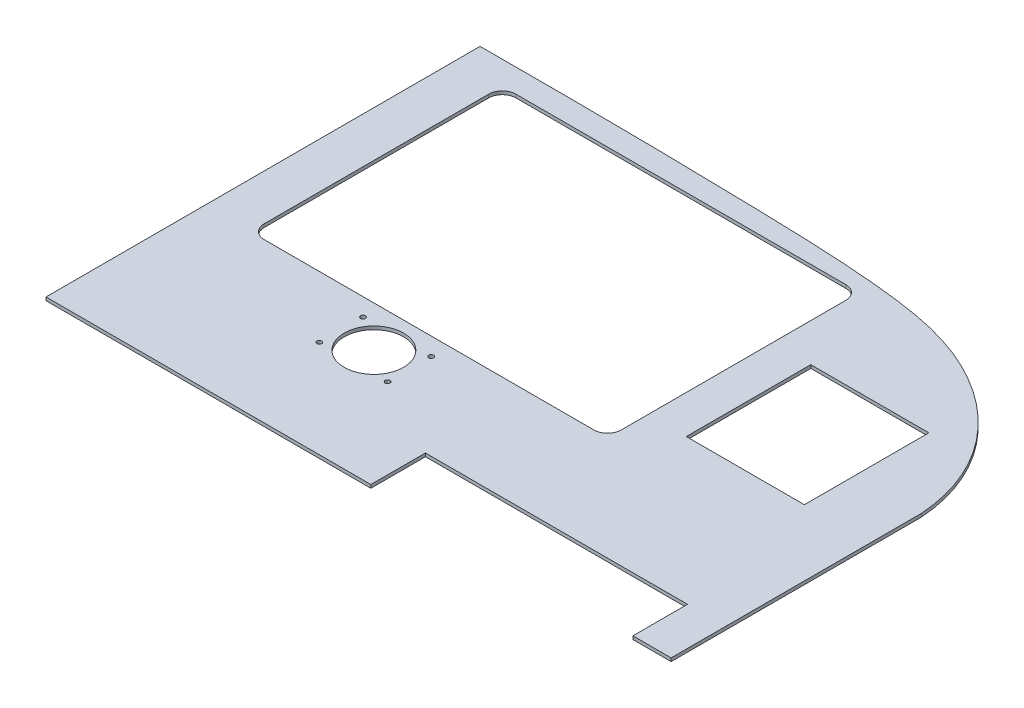
ISO-10303-21;
HEADER;
FILE_DESCRIPTION(('STEP AP214'),'2;1');
FILE_NAME('part.step','',(''),(''),'','','');
FILE_SCHEMA(('AUTOMOTIVE_DESIGN { 1 0 10303 214 1 1 1 1 }'));
ENDSEC;
DATA;
#1=APPLICATION_CONTEXT('core data for automotive mechanical design processes');
#2=APPLICATION_PROTOCOL_DEFINITION('international standard','automotive_design',2000,#1);
#3=PRODUCT_CONTEXT('',#1,'mechanical');
#4=PRODUCT('Part','Part','',(#3));
#5=PRODUCT_RELATED_PRODUCT_CATEGORY('part','',(#4));
#6=PRODUCT_DEFINITION_FORMATION('','',#4);
#7=PRODUCT_DEFINITION_CONTEXT('part definition',#1,'design');
#8=PRODUCT_DEFINITION('design','',#6,#7);
#9=PRODUCT_DEFINITION_SHAPE('','',#8);
#10=(LENGTH_UNIT() NAMED_UNIT(*) SI_UNIT(.MILLI.,.METRE.));
#11=(NAMED_UNIT(*) PLANE_ANGLE_UNIT() SI_UNIT($,.RADIAN.));
#12=(NAMED_UNIT(*) SI_UNIT($,.STERADIAN.) SOLID_ANGLE_UNIT());
#13=UNCERTAINTY_MEASURE_WITH_UNIT(LENGTH_MEASURE(1.E-05),#10,'distance_accuracy_value','');
#14=(GEOMETRIC_REPRESENTATION_CONTEXT(3) GLOBAL_UNCERTAINTY_ASSIGNED_CONTEXT((#13)) GLOBAL_UNIT_ASSIGNED_CONTEXT((#10,
#11,#12)) REPRESENTATION_CONTEXT('',''));
#15=CARTESIAN_POINT('',(0.,0.,0.));
#16=DIRECTION('',(0.,0.,1.));
#17=DIRECTION('',(1.,0.,0.));
#18=AXIS2_PLACEMENT_3D('',#15,#16,#17);
#19=CARTESIAN_POINT('',(291.81867190255,2.4,-147.875787180566));
#20=DIRECTION('',(0.,1.,0.));
#21=DIRECTION('',(0.,0.,1.));
#22=AXIS2_PLACEMENT_3D('',#19,#20,#21);
#23=PLANE('',#22);
#24=CARTESIAN_POINT('',(160.955943970806,2.4,94.9187674166693));
#25=DIRECTION('',(0.,1.,0.));
#26=DIRECTION('',(0.,0.,1.));
#27=AXIS2_PLACEMENT_3D('',#24,#25,#26);
#28=CIRCLE('',#27,1.74999999999998);
#29=CARTESIAN_POINT('',(160.955943970806,2.4,96.6687674166693));
#30=VERTEX_POINT('',#29);
#31=EDGE_CURVE('E237',#30,#30,#28,.T.);
#32=ORIENTED_EDGE('',*,*,#31,.F.);
#33=EDGE_LOOP('',(#32));
#34=FACE_BOUND('',#33,.T.);
#35=CARTESIAN_POINT('',(210.955943970806,2.4,94.9187674166693));
#36=DIRECTION('',(0.,1.,0.));
#37=DIRECTION('',(0.,0.,1.));
#38=AXIS2_PLACEMENT_3D('',#35,#36,#37);
#39=CIRCLE('',#38,1.74999999999998);
#40=CARTESIAN_POINT('',(210.955943970806,2.4,96.6687674166693));
#41=VERTEX_POINT('',#40);
#42=EDGE_CURVE('E336',#41,#41,#39,.T.);
#43=ORIENTED_EDGE('',*,*,#42,.F.);
#44=EDGE_LOOP('',(#43));
#45=FACE_BOUND('',#44,.T.);
#46=DIRECTION('',(0.,0.,-1.));
#47=VECTOR('',#46,1.);
#48=CARTESIAN_POINT('',(270.055943970805,2.4,166.244094236359));
#49=LINE('',#48,#47);
#50=CARTESIAN_POINT('',(270.055943970805,2.4,166.244094236359));
#51=VERTEX_POINT('',#50);
#52=CARTESIAN_POINT('',(270.055943970805,2.4,126.244094236359));
#53=VERTEX_POINT('',#52);
#54=EDGE_CURVE('E352',#51,#53,#49,.T.);
#55=ORIENTED_EDGE('',*,*,#54,.T.);
#56=DIRECTION('',(1.,0.,0.));
#57=VECTOR('',#56,1.);
#58=CARTESIAN_POINT('',(462.055943970805,2.4,126.244094236359));
#59=LINE('',#58,#57);
#60=CARTESIAN_POINT('',(462.055943970805,2.4,126.244094236359));
#61=VERTEX_POINT('',#60);
#62=EDGE_CURVE('E356',#53,#61,#59,.T.);
#63=ORIENTED_EDGE('',*,*,#62,.T.);
#64=DIRECTION('',(0.,0.,1.));
#65=VECTOR('',#64,1.);
#66=CARTESIAN_POINT('',(462.055943970805,2.4,126.244094236359));
#67=LINE('',#66,#65);
#68=CARTESIAN_POINT('',(462.055943970805,2.4,166.244094236359));
#69=VERTEX_POINT('',#68);
#70=EDGE_CURVE('E360',#61,#69,#67,.T.);
#71=ORIENTED_EDGE('',*,*,#70,.T.);
#72=DIRECTION('',(1.,0.,0.));
#73=VECTOR('',#72,1.);
#74=CARTESIAN_POINT('',(462.055943970805,2.4,166.244094236359));
#75=LINE('',#74,#73);
#76=CARTESIAN_POINT('',(490.055943970805,2.4,166.244094236359));
#77=VERTEX_POINT('',#76);
#78=EDGE_CURVE('E363',#69,#77,#75,.T.);
#79=ORIENTED_EDGE('',*,*,#78,.T.);
#80=DIRECTION('',(0.,0.,-1.));
#81=VECTOR('',#80,1.);
#82=CARTESIAN_POINT('',(490.055943970805,2.4,166.244094236359));
#83=LINE('',#82,#81);
#84=CARTESIAN_POINT('',(490.055943970805,2.4,-17.1594549133934));
#85=VERTEX_POINT('',#84);
#86=EDGE_CURVE('E366',#77,#85,#83,.T.);
#87=ORIENTED_EDGE('',*,*,#86,.T.);
#88=CARTESIAN_POINT('',(490.055943970805,2.4,-17.1594549133934));
#89=CARTESIAN_POINT('',(485.960084459969,2.4,-74.2725584664773));
#90=CARTESIAN_POINT('',(425.617825051017,2.4,-131.81341344977));
#91=CARTESIAN_POINT('',(322.889642457425,2.4,-147.223796338718));
#92=CARTESIAN_POINT('',(202.389819544414,2.4,-151.163122700745));
#93=CARTESIAN_POINT('',(102.52055171968,2.4,-152.083892996162));
#94=CARTESIAN_POINT('',(32.0559439708054,2.4,-151.755905763641));
#95=B_SPLINE_CURVE_WITH_KNOTS('',3,(#88,#89,#90,#91,#92,#93,#94),.UNSPECIFIED.,.F.,.F.,(4,1,1,1,
4),(0.,0.30392132411296,0.421595858926992,0.595032022149587,1.),.UNSPECIFIED.);
#96=CARTESIAN_POINT('',(32.0559439708054,2.4,-151.755905763641));
#97=VERTEX_POINT('',#96);
#98=EDGE_CURVE('E369',#85,#97,#95,.T.);
#99=ORIENTED_EDGE('',*,*,#98,.T.);
#100=DIRECTION('',(0.,0.,1.));
#101=VECTOR('',#100,1.);
#102=CARTESIAN_POINT('',(32.0559439708054,2.4,166.244094236359));
#103=LINE('',#102,#101);
#104=CARTESIAN_POINT('',(32.0559439708054,2.4,166.244094236359));
#105=VERTEX_POINT('',#104);
#106=EDGE_CURVE('E375',#97,#105,#103,.T.);
#107=ORIENTED_EDGE('',*,*,#106,.T.);
#108=DIRECTION('',(1.,0.,0.));
#109=VECTOR('',#108,1.);
#110=CARTESIAN_POINT('',(32.0559439708054,2.4,166.244094236359));
#111=LINE('',#110,#109);
#112=EDGE_CURVE('E448',#105,#51,#111,.T.);
#113=ORIENTED_EDGE('',*,*,#112,.T.);
#114=EDGE_LOOP('',(#55,#63,#71,#79,#87,#99,#107,#113));
#115=FACE_BOUND('',#114,.T.);
#116=CARTESIAN_POINT('',(210.955943970805,2.4,62.9187674166693));
#117=DIRECTION('',(0.,1.,0.));
#118=DIRECTION('',(0.,0.,1.));
#119=AXIS2_PLACEMENT_3D('',#116,#117,#118);
#120=CIRCLE('',#119,1.74999999999998);
#121=CARTESIAN_POINT('',(210.955943970805,2.4,64.6687674166693));
#122=VERTEX_POINT('',#121);
#123=EDGE_CURVE('E344',#122,#122,#120,.T.);
#124=ORIENTED_EDGE('',*,*,#123,.F.);
#125=EDGE_LOOP('',(#124));
#126=FACE_BOUND('',#125,.T.);
#127=CARTESIAN_POINT('',(185.955943970805,2.4,79.9187674166693));
#128=DIRECTION('',(0.,1.,0.));
#129=DIRECTION('',(0.,0.,1.));
#130=AXIS2_PLACEMENT_3D('',#127,#128,#129);
#131=CIRCLE('',#130,21.7500000000001);
#132=CARTESIAN_POINT('',(185.955943970805,2.4,101.668767416669));
#133=VERTEX_POINT('',#132);
#134=EDGE_CURVE('E328',#133,#133,#131,.T.);
#135=ORIENTED_EDGE('',*,*,#134,.F.);
#136=EDGE_LOOP('',(#135));
#137=FACE_BOUND('',#136,.T.);
#138=DIRECTION('',(0.,0.,-1.));
#139=VECTOR('',#138,1.);
#140=CARTESIAN_POINT('',(327.18359489629,2.4,-124.58123258333));
#141=LINE('',#140,#139);
#142=CARTESIAN_POINT('',(327.18359489629,2.4,39.9187674166696));
#143=VERTEX_POINT('',#142);
#144=CARTESIAN_POINT('',(327.18359489629,2.4,-124.58123258333));
#145=VERTEX_POINT('',#144);
#146=EDGE_CURVE('E248',#143,#145,#141,.T.);
#147=ORIENTED_EDGE('',*,*,#146,.F.);
#148=CARTESIAN_POINT('',(317.18359489629,2.4,39.9187674166696));
#149=DIRECTION('',(0.,1.,0.));
#150=DIRECTION('',(0.,0.,1.));
#151=AXIS2_PLACEMENT_3D('',#148,#149,#150);
#152=CIRCLE('',#151,9.99999999999972);
#153=CARTESIAN_POINT('',(317.18359489629,2.4,49.9187674166693));
#154=VERTEX_POINT('',#153);
#155=EDGE_CURVE('E245',#154,#143,#152,.T.);
#156=ORIENTED_EDGE('',*,*,#155,.F.);
#157=DIRECTION('',(1.,0.,0.));
#158=VECTOR('',#157,1.);
#159=CARTESIAN_POINT('',(75.5559439708052,2.4,49.9187674166693));
#160=LINE('',#159,#158);
#161=CARTESIAN_POINT('',(75.5559439708052,2.4,49.9187674166693));
#162=VERTEX_POINT('',#161);
#163=EDGE_CURVE('E268',#162,#154,#160,.T.);
#164=ORIENTED_EDGE('',*,*,#163,.F.);
#165=CARTESIAN_POINT('',(75.5559439708052,2.4,39.9187674166696));
#166=DIRECTION('',(0.,1.,0.));
#167=DIRECTION('',(0.,0.,-1.));
#168=AXIS2_PLACEMENT_3D('',#165,#166,#167);
#169=CIRCLE('',#168,9.99999999999976);
#170=CARTESIAN_POINT('',(65.5559439708054,2.4,39.9187674166696));
#171=VERTEX_POINT('',#170);
#172=EDGE_CURVE('E264',#171,#162,#169,.T.);
#173=ORIENTED_EDGE('',*,*,#172,.F.);
#174=DIRECTION('',(0.,0.,1.));
#175=VECTOR('',#174,1.);
#176=CARTESIAN_POINT('',(65.5559439708054,2.4,-124.58123258333));
#177=LINE('',#176,#175);
#178=CARTESIAN_POINT('',(65.5559439708054,2.4,-124.58123258333));
#179=VERTEX_POINT('',#178);
#180=EDGE_CURVE('E261',#179,#171,#177,.T.);
#181=ORIENTED_EDGE('',*,*,#180,.F.);
#182=CARTESIAN_POINT('',(75.5559439708052,2.4,-124.58123258333));
#183=DIRECTION('',(0.,1.,0.));
#184=DIRECTION('',(0.,0.,1.));
#185=AXIS2_PLACEMENT_3D('',#182,#183,#184);
#186=CIRCLE('',#185,9.99999999999977);
#187=CARTESIAN_POINT('',(75.5559439708052,2.4,-134.58123258333));
#188=VERTEX_POINT('',#187);
#189=EDGE_CURVE('E258',#188,#179,#186,.T.);
#190=ORIENTED_EDGE('',*,*,#189,.F.);
#191=DIRECTION('',(-1.,0.,0.));
#192=VECTOR('',#191,1.);
#193=CARTESIAN_POINT('',(75.5559439708052,2.4,-134.58123258333));
#194=LINE('',#193,#192);
#195=CARTESIAN_POINT('',(317.18359489629,2.4,-134.58123258333));
#196=VERTEX_POINT('',#195);
#197=EDGE_CURVE('E255',#196,#188,#194,.T.);
#198=ORIENTED_EDGE('',*,*,#197,.F.);
#199=CARTESIAN_POINT('',(317.18359489629,2.4,-124.58123258333));
#200=DIRECTION('',(0.,1.,0.));
#201=DIRECTION('',(0.,0.,-1.));
#202=AXIS2_PLACEMENT_3D('',#199,#200,#201);
#203=CIRCLE('',#202,9.99999999999975);
#204=EDGE_CURVE('E252',#145,#196,#203,.T.);
#205=ORIENTED_EDGE('',*,*,#204,.F.);
#206=EDGE_LOOP('',(#147,#156,#164,#173,#181,#190,#198,#205));
#207=FACE_BOUND('',#206,.T.);
#208=CARTESIAN_POINT('',(160.955943970805,2.4,62.9187674166693));
#209=DIRECTION('',(0.,1.,0.));
#210=DIRECTION('',(0.,0.,1.));
#211=AXIS2_PLACEMENT_3D('',#208,#209,#210);
#212=CIRCLE('',#211,1.74999999999998);
#213=CARTESIAN_POINT('',(160.955943970805,2.4,64.6687674166693));
#214=VERTEX_POINT('',#213);
#215=EDGE_CURVE('E229',#214,#214,#212,.T.);
#216=ORIENTED_EDGE('',*,*,#215,.F.);
#217=EDGE_LOOP('',(#216));
#218=FACE_BOUND('',#217,.T.);
#219=DIRECTION('',(1.,0.,0.));
#220=VECTOR('',#219,1.);
#221=CARTESIAN_POINT('',(355.18359489629,2.4,20.2440942363591));
#222=LINE('',#221,#220);
#223=CARTESIAN_POINT('',(355.18359489629,2.4,20.2440942363591));
#224=VERTEX_POINT('',#223);
#225=CARTESIAN_POINT('',(441.68359489629,2.4,20.2440942363591));
#226=VERTEX_POINT('',#225);
#227=EDGE_CURVE('E190',#224,#226,#222,.T.);
#228=ORIENTED_EDGE('',*,*,#227,.F.);
#229=DIRECTION('',(0.,0.,1.));
#230=VECTOR('',#229,1.);
#231=CARTESIAN_POINT('',(355.18359489629,2.4,-70.9559057636409));
#232=LINE('',#231,#230);
#233=CARTESIAN_POINT('',(355.18359489629,2.4,-70.9559057636409));
#234=VERTEX_POINT('',#233);
#235=EDGE_CURVE('E181',#234,#224,#232,.T.);
#236=ORIENTED_EDGE('',*,*,#235,.F.);
#237=DIRECTION('',(-1.,0.,0.));
#238=VECTOR('',#237,1.);
#239=CARTESIAN_POINT('',(355.18359489629,2.4,-70.9559057636409));
#240=LINE('',#239,#238);
#241=CARTESIAN_POINT('',(441.68359489629,2.4,-70.9559057636409));
#242=VERTEX_POINT('',#241);
#243=EDGE_CURVE('E207',#242,#234,#240,.T.);
#244=ORIENTED_EDGE('',*,*,#243,.F.);
#245=DIRECTION('',(0.,0.,-1.));
#246=VECTOR('',#245,1.);
#247=CARTESIAN_POINT('',(441.68359489629,2.4,-70.9559057636409));
#248=LINE('',#247,#246);
#249=EDGE_CURVE('E203',#226,#242,#248,.T.);
#250=ORIENTED_EDGE('',*,*,#249,.F.);
#251=EDGE_LOOP('',(#228,#236,#244,#250));
#252=FACE_BOUND('',#251,.T.);
#253=ADVANCED_FACE('F43',(#34,#45,#115,#126,#137,#207,#218,#252),#23,.T.);
#254=CARTESIAN_POINT('',(291.81867190255,0.,-147.875787180566));
#255=DIRECTION('',(0.,1.,0.));
#256=DIRECTION('',(0.,0.,1.));
#257=AXIS2_PLACEMENT_3D('',#254,#255,#256);
#258=PLANE('',#257);
#259=CARTESIAN_POINT('',(160.955943970805,0.,62.9187674166693));
#260=DIRECTION('',(0.,1.,0.));
#261=DIRECTION('',(0.,0.,1.));
#262=AXIS2_PLACEMENT_3D('',#259,#260,#261);
#263=CIRCLE('',#262,1.74999999999998);
#264=CARTESIAN_POINT('',(160.955943970805,0.,64.6687674166693));
#265=VERTEX_POINT('',#264);
#266=EDGE_CURVE('E199',#265,#265,#263,.T.);
#267=ORIENTED_EDGE('',*,*,#266,.T.);
#268=EDGE_LOOP('',(#267));
#269=FACE_BOUND('',#268,.T.);
#270=CARTESIAN_POINT('',(160.955943970806,0.,94.9187674166693));
#271=DIRECTION('',(0.,1.,0.));
#272=DIRECTION('',(0.,0.,1.));
#273=AXIS2_PLACEMENT_3D('',#270,#271,#272);
#274=CIRCLE('',#273,1.74999999999998);
#275=CARTESIAN_POINT('',(160.955943970806,0.,96.6687674166693));
#276=VERTEX_POINT('',#275);
#277=EDGE_CURVE('E233',#276,#276,#274,.T.);
#278=ORIENTED_EDGE('',*,*,#277,.T.);
#279=EDGE_LOOP('',(#278));
#280=FACE_BOUND('',#279,.T.);
#281=CARTESIAN_POINT('',(317.18359489629,0.,39.9187674166696));
#282=DIRECTION('',(0.,1.,0.));
#283=DIRECTION('',(0.,0.,1.));
#284=AXIS2_PLACEMENT_3D('',#281,#282,#283);
#285=CIRCLE('',#284,9.99999999999972);
#286=CARTESIAN_POINT('',(317.18359489629,0.,49.9187674166693));
#287=VERTEX_POINT('',#286);
#288=CARTESIAN_POINT('',(327.18359489629,0.,39.9187674166696));
#289=VERTEX_POINT('',#288);
#290=EDGE_CURVE('E241',#287,#289,#285,.T.);
#291=ORIENTED_EDGE('',*,*,#290,.T.);
#292=DIRECTION('',(0.,0.,-1.));
#293=VECTOR('',#292,1.);
#294=CARTESIAN_POINT('',(327.18359489629,0.,-124.58123258333));
#295=LINE('',#294,#293);
#296=CARTESIAN_POINT('',(327.18359489629,0.,-124.58123258333));
#297=VERTEX_POINT('',#296);
#298=EDGE_CURVE('E275',#289,#297,#295,.T.);
#299=ORIENTED_EDGE('',*,*,#298,.T.);
#300=CARTESIAN_POINT('',(317.18359489629,0.,-124.58123258333));
#301=DIRECTION('',(0.,1.,0.));
#302=DIRECTION('',(0.,0.,-1.));
#303=AXIS2_PLACEMENT_3D('',#300,#301,#302);
#304=CIRCLE('',#303,9.99999999999975);
#305=CARTESIAN_POINT('',(317.18359489629,0.,-134.58123258333));
#306=VERTEX_POINT('',#305);
#307=EDGE_CURVE('E279',#297,#306,#304,.T.);
#308=ORIENTED_EDGE('',*,*,#307,.T.);
#309=DIRECTION('',(-1.,0.,0.));
#310=VECTOR('',#309,1.);
#311=CARTESIAN_POINT('',(75.5559439708052,0.,-134.58123258333));
#312=LINE('',#311,#310);
#313=CARTESIAN_POINT('',(75.5559439708052,0.,-134.58123258333));
#314=VERTEX_POINT('',#313);
#315=EDGE_CURVE('E283',#306,#314,#312,.T.);
#316=ORIENTED_EDGE('',*,*,#315,.T.);
#317=CARTESIAN_POINT('',(75.5559439708052,0.,-124.58123258333));
#318=DIRECTION('',(0.,1.,0.));
#319=DIRECTION('',(0.,0.,1.));
#320=AXIS2_PLACEMENT_3D('',#317,#318,#319);
#321=CIRCLE('',#320,9.99999999999977);
#322=CARTESIAN_POINT('',(65.5559439708054,0.,-124.58123258333));
#323=VERTEX_POINT('',#322);
#324=EDGE_CURVE('E287',#314,#323,#321,.T.);
#325=ORIENTED_EDGE('',*,*,#324,.T.);
#326=DIRECTION('',(0.,0.,1.));
#327=VECTOR('',#326,1.);
#328=CARTESIAN_POINT('',(65.5559439708054,0.,-124.58123258333));
#329=LINE('',#328,#327);
#330=CARTESIAN_POINT('',(65.5559439708054,0.,39.9187674166696));
#331=VERTEX_POINT('',#330);
#332=EDGE_CURVE('E291',#323,#331,#329,.T.);
#333=ORIENTED_EDGE('',*,*,#332,.T.);
#334=CARTESIAN_POINT('',(75.5559439708052,0.,39.9187674166696));
#335=DIRECTION('',(0.,1.,0.));
#336=DIRECTION('',(0.,0.,-1.));
#337=AXIS2_PLACEMENT_3D('',#334,#335,#336);
#338=CIRCLE('',#337,9.99999999999976);
#339=CARTESIAN_POINT('',(75.5559439708052,0.,49.9187674166693));
#340=VERTEX_POINT('',#339);
#341=EDGE_CURVE('E295',#331,#340,#338,.T.);
#342=ORIENTED_EDGE('',*,*,#341,.T.);
#343=DIRECTION('',(1.,0.,0.));
#344=VECTOR('',#343,1.);
#345=CARTESIAN_POINT('',(75.5559439708052,0.,49.9187674166693));
#346=LINE('',#345,#344);
#347=EDGE_CURVE('E249',#340,#287,#346,.T.);
#348=ORIENTED_EDGE('',*,*,#347,.T.);
#349=EDGE_LOOP('',(#291,#299,#308,#316,#325,#333,#342,#348));
#350=FACE_BOUND('',#349,.T.);
#351=DIRECTION('',(0.,0.,-1.));
#352=VECTOR('',#351,1.);
#353=CARTESIAN_POINT('',(270.055943970805,0.,166.244094236359));
#354=LINE('',#353,#352);
#355=CARTESIAN_POINT('',(270.055943970805,0.,166.244094236359));
#356=VERTEX_POINT('',#355);
#357=CARTESIAN_POINT('',(270.055943970805,0.,126.244094236359));
#358=VERTEX_POINT('',#357);
#359=EDGE_CURVE('E348',#356,#358,#354,.T.);
#360=ORIENTED_EDGE('',*,*,#359,.F.);
#361=DIRECTION('',(1.,0.,0.));
#362=VECTOR('',#361,1.);
#363=CARTESIAN_POINT('',(32.0559439708054,0.,166.244094236359));
#364=LINE('',#363,#362);
#365=CARTESIAN_POINT('',(32.0559439708054,0.,166.244094236359));
#366=VERTEX_POINT('',#365);
#367=EDGE_CURVE('E357',#366,#356,#364,.T.);
#368=ORIENTED_EDGE('',*,*,#367,.F.);
#369=DIRECTION('',(0.,0.,1.));
#370=VECTOR('',#369,1.);
#371=CARTESIAN_POINT('',(32.0559439708054,0.,166.244094236359));
#372=LINE('',#371,#370);
#373=CARTESIAN_POINT('',(32.0559439708054,0.,-151.755905763641));
#374=VERTEX_POINT('',#373);
#375=EDGE_CURVE('E443',#374,#366,#372,.T.);
#376=ORIENTED_EDGE('',*,*,#375,.F.);
#377=CARTESIAN_POINT('',(490.055943970805,0.,-17.1594549133934));
#378=CARTESIAN_POINT('',(485.960084459969,0.,-74.2725584664773));
#379=CARTESIAN_POINT('',(425.617825051017,0.,-131.81341344977));
#380=CARTESIAN_POINT('',(322.889642457425,0.,-147.223796338718));
#381=CARTESIAN_POINT('',(202.389819544414,0.,-151.163122700745));
#382=CARTESIAN_POINT('',(102.52055171968,0.,-152.083892996162));
#383=CARTESIAN_POINT('',(32.0559439708054,0.,-151.755905763641));
#384=B_SPLINE_CURVE_WITH_KNOTS('',3,(#377,#378,#379,#380,#381,#382,#383),.UNSPECIFIED.,.F.,.F.,
(4,1,1,1,4),(0.,0.30392132411296,0.421595858926992,0.595032022149587,1.),.UNSPECIFIED.);
#385=CARTESIAN_POINT('',(490.055943970805,0.,-17.1594549133934));
#386=VERTEX_POINT('',#385);
#387=EDGE_CURVE('E468',#386,#374,#384,.T.);
#388=ORIENTED_EDGE('',*,*,#387,.F.);
#389=DIRECTION('',(0.,0.,-1.));
#390=VECTOR('',#389,1.);
#391=CARTESIAN_POINT('',(490.055943970805,0.,126.244094236359));
#392=LINE('',#391,#390);
#393=CARTESIAN_POINT('',(490.055943970805,0.,166.244094236359));
#394=VERTEX_POINT('',#393);
#395=EDGE_CURVE('E465',#394,#386,#392,.T.);
#396=ORIENTED_EDGE('',*,*,#395,.F.);
#397=DIRECTION('',(1.,0.,0.));
#398=VECTOR('',#397,1.);
#399=CARTESIAN_POINT('',(462.055943970805,0.,166.244094236359));
#400=LINE('',#399,#398);
#401=CARTESIAN_POINT('',(462.055943970805,0.,166.244094236359));
#402=VERTEX_POINT('',#401);
#403=EDGE_CURVE('E461',#402,#394,#400,.T.);
#404=ORIENTED_EDGE('',*,*,#403,.F.);
#405=DIRECTION('',(0.,0.,1.));
#406=VECTOR('',#405,1.);
#407=CARTESIAN_POINT('',(462.055943970805,0.,126.244094236359));
#408=LINE('',#407,#406);
#409=CARTESIAN_POINT('',(462.055943970805,0.,126.244094236359));
#410=VERTEX_POINT('',#409);
#411=EDGE_CURVE('E456',#410,#402,#408,.T.);
#412=ORIENTED_EDGE('',*,*,#411,.F.);
#413=DIRECTION('',(1.,0.,0.));
#414=VECTOR('',#413,1.);
#415=CARTESIAN_POINT('',(462.055943970805,0.,126.244094236359));
#416=LINE('',#415,#414);
#417=EDGE_CURVE('E452',#358,#410,#416,.T.);
#418=ORIENTED_EDGE('',*,*,#417,.F.);
#419=EDGE_LOOP('',(#360,#368,#376,#388,#396,#404,#412,#418));
#420=FACE_BOUND('',#419,.T.);
#421=CARTESIAN_POINT('',(210.955943970805,0.,62.9187674166693));
#422=DIRECTION('',(0.,1.,0.));
#423=DIRECTION('',(0.,0.,1.));
#424=AXIS2_PLACEMENT_3D('',#421,#422,#423);
#425=CIRCLE('',#424,1.74999999999998);
#426=CARTESIAN_POINT('',(210.955943970805,0.,64.6687674166693));
#427=VERTEX_POINT('',#426);
#428=EDGE_CURVE('E340',#427,#427,#425,.T.);
#429=ORIENTED_EDGE('',*,*,#428,.T.);
#430=EDGE_LOOP('',(#429));
#431=FACE_BOUND('',#430,.T.);
#432=CARTESIAN_POINT('',(210.955943970806,0.,94.9187674166693));
#433=DIRECTION('',(0.,1.,0.));
#434=DIRECTION('',(0.,0.,1.));
#435=AXIS2_PLACEMENT_3D('',#432,#433,#434);
#436=CIRCLE('',#435,1.74999999999998);
#437=CARTESIAN_POINT('',(210.955943970806,0.,96.6687674166693));
#438=VERTEX_POINT('',#437);
#439=EDGE_CURVE('E332',#438,#438,#436,.T.);
#440=ORIENTED_EDGE('',*,*,#439,.T.);
#441=EDGE_LOOP('',(#440));
#442=FACE_BOUND('',#441,.T.);
#443=CARTESIAN_POINT('',(185.955943970805,0.,79.9187674166693));
#444=DIRECTION('',(0.,1.,0.));
#445=DIRECTION('',(0.,0.,1.));
#446=AXIS2_PLACEMENT_3D('',#443,#444,#445);
#447=CIRCLE('',#446,21.7500000000001);
#448=CARTESIAN_POINT('',(185.955943970805,0.,101.668767416669));
#449=VERTEX_POINT('',#448);
#450=EDGE_CURVE('E327',#449,#449,#447,.T.);
#451=ORIENTED_EDGE('',*,*,#450,.T.);
#452=EDGE_LOOP('',(#451));
#453=FACE_BOUND('',#452,.T.);
#454=DIRECTION('',(0.,0.,1.));
#455=VECTOR('',#454,1.);
#456=CARTESIAN_POINT('',(355.18359489629,0.,-70.9559057636409));
#457=LINE('',#456,#455);
#458=CARTESIAN_POINT('',(355.18359489629,0.,-70.9559057636409));
#459=VERTEX_POINT('',#458);
#460=CARTESIAN_POINT('',(355.18359489629,0.,20.2440942363591));
#461=VERTEX_POINT('',#460);
#462=EDGE_CURVE('E67',#459,#461,#457,.T.);
#463=ORIENTED_EDGE('',*,*,#462,.T.);
#464=DIRECTION('',(1.,0.,0.));
#465=VECTOR('',#464,1.);
#466=CARTESIAN_POINT('',(355.18359489629,0.,20.2440942363591));
#467=LINE('',#466,#465);
#468=CARTESIAN_POINT('',(441.68359489629,0.,20.2440942363591));
#469=VERTEX_POINT('',#468);
#470=EDGE_CURVE('E197',#461,#469,#467,.T.);
#471=ORIENTED_EDGE('',*,*,#470,.T.);
#472=DIRECTION('',(0.,0.,-1.));
#473=VECTOR('',#472,1.);
#474=CARTESIAN_POINT('',(441.68359489629,0.,-70.9559057636409));
#475=LINE('',#474,#473);
#476=CARTESIAN_POINT('',(441.68359489629,0.,-70.9559057636409));
#477=VERTEX_POINT('',#476);
#478=EDGE_CURVE('E216',#469,#477,#475,.T.);
#479=ORIENTED_EDGE('',*,*,#478,.T.);
#480=DIRECTION('',(-1.,0.,0.));
#481=VECTOR('',#480,1.);
#482=CARTESIAN_POINT('',(355.18359489629,0.,-70.9559057636409));
#483=LINE('',#482,#481);
#484=EDGE_CURVE('E191',#477,#459,#483,.T.);
#485=ORIENTED_EDGE('',*,*,#484,.T.);
#486=EDGE_LOOP('',(#463,#471,#479,#485));
#487=FACE_BOUND('',#486,.T.);
#488=ADVANCED_FACE('F405',(#269,#280,#350,#420,#431,#442,#453,#487),#258,.F.);
#489=CARTESIAN_POINT('',(270.055943970805,2.4,166.244094236359));
#490=DIRECTION('',(-1.,0.,0.));
#491=DIRECTION('',(0.,0.,1.));
#492=AXIS2_PLACEMENT_3D('',#489,#490,#491);
#493=PLANE('',#492);
#494=ORIENTED_EDGE('',*,*,#359,.T.);
#495=DIRECTION('',(0.,-1.,0.));
#496=VECTOR('',#495,1.);
#497=CARTESIAN_POINT('',(270.055943970805,2.4,126.244094236359));
#498=LINE('',#497,#496);
#499=EDGE_CURVE('E11',#53,#358,#498,.T.);
#500=ORIENTED_EDGE('',*,*,#499,.F.);
#501=ORIENTED_EDGE('',*,*,#54,.F.);
#502=DIRECTION('',(0.,-1.,0.));
#503=VECTOR('',#502,1.);
#504=CARTESIAN_POINT('',(270.055943970805,2.4,166.244094236359));
#505=LINE('',#504,#503);
#506=EDGE_CURVE('E435',#51,#356,#505,.T.);
#507=ORIENTED_EDGE('',*,*,#506,.T.);
#508=EDGE_LOOP('',(#494,#500,#501,#507));
#509=FACE_BOUND('',#508,.T.);
#510=ADVANCED_FACE('F45',(#509),#493,.F.);
#511=CARTESIAN_POINT('',(462.055943970805,2.4,126.244094236359));
#512=DIRECTION('',(0.,0.,-1.));
#513=DIRECTION('',(-1.,0.,0.));
#514=AXIS2_PLACEMENT_3D('',#511,#512,#513);
#515=PLANE('',#514);
#516=ORIENTED_EDGE('',*,*,#417,.T.);
#517=DIRECTION('',(0.,-1.,0.));
#518=VECTOR('',#517,1.);
#519=CARTESIAN_POINT('',(462.055943970805,2.4,126.244094236359));
#520=LINE('',#519,#518);
#521=EDGE_CURVE('E52',#61,#410,#520,.T.);
#522=ORIENTED_EDGE('',*,*,#521,.F.);
#523=ORIENTED_EDGE('',*,*,#62,.F.);
#524=ORIENTED_EDGE('',*,*,#499,.T.);
#525=EDGE_LOOP('',(#516,#522,#523,#524));
#526=FACE_BOUND('',#525,.T.);
#527=ADVANCED_FACE('F398',(#526),#515,.F.);
#528=CARTESIAN_POINT('',(462.055943970805,2.4,126.244094236359));
#529=DIRECTION('',(1.,0.,0.));
#530=DIRECTION('',(0.,0.,-1.));
#531=AXIS2_PLACEMENT_3D('',#528,#529,#530);
#532=PLANE('',#531);
#533=ORIENTED_EDGE('',*,*,#411,.T.);
#534=DIRECTION('',(0.,-1.,0.));
#535=VECTOR('',#534,1.);
#536=CARTESIAN_POINT('',(462.055943970805,2.4,166.244094236359));
#537=LINE('',#536,#535);
#538=EDGE_CURVE('E492',#69,#402,#537,.T.);
#539=ORIENTED_EDGE('',*,*,#538,.F.);
#540=ORIENTED_EDGE('',*,*,#70,.F.);
#541=ORIENTED_EDGE('',*,*,#521,.T.);
#542=EDGE_LOOP('',(#533,#539,#540,#541));
#543=FACE_BOUND('',#542,.T.);
#544=ADVANCED_FACE('F395',(#543),#532,.F.);
#545=CARTESIAN_POINT('',(462.055943970805,2.4,166.244094236359));
#546=DIRECTION('',(0.,0.,-1.));
#547=DIRECTION('',(-1.,0.,0.));
#548=AXIS2_PLACEMENT_3D('',#545,#546,#547);
#549=PLANE('',#548);
#550=ORIENTED_EDGE('',*,*,#403,.T.);
#551=DIRECTION('',(0.,-1.,0.));
#552=VECTOR('',#551,1.);
#553=CARTESIAN_POINT('',(490.055943970805,2.4,166.244094236359));
#554=LINE('',#553,#552);
#555=EDGE_CURVE('E488',#77,#394,#554,.T.);
#556=ORIENTED_EDGE('',*,*,#555,.F.);
#557=ORIENTED_EDGE('',*,*,#78,.F.);
#558=ORIENTED_EDGE('',*,*,#538,.T.);
#559=EDGE_LOOP('',(#550,#556,#557,#558));
#560=FACE_BOUND('',#559,.T.);
#561=ADVANCED_FACE('F391',(#560),#549,.F.);
#562=CARTESIAN_POINT('',(490.055943970805,2.4,126.244094236359));
#563=DIRECTION('',(-1.,0.,0.));
#564=DIRECTION('',(0.,0.,1.));
#565=AXIS2_PLACEMENT_3D('',#562,#563,#564);
#566=PLANE('',#565);
#567=ORIENTED_EDGE('',*,*,#395,.T.);
#568=DIRECTION('',(0.,-1.,0.));
#569=VECTOR('',#568,1.);
#570=CARTESIAN_POINT('',(490.055943970805,2.4,-17.1594549133934));
#571=LINE('',#570,#569);
#572=EDGE_CURVE('E484',#85,#386,#571,.T.);
#573=ORIENTED_EDGE('',*,*,#572,.F.);
#574=ORIENTED_EDGE('',*,*,#86,.F.);
#575=ORIENTED_EDGE('',*,*,#555,.T.);
#576=EDGE_LOOP('',(#567,#573,#574,#575));
#577=FACE_BOUND('',#576,.T.);
#578=ADVANCED_FACE('F386',(#577),#566,.F.);
#579=DIRECTION('',(0.,-1.,0.));
#580=VECTOR('',#579,1.);
#581=SURFACE_OF_LINEAR_EXTRUSION('',#95,#580);
#582=ORIENTED_EDGE('',*,*,#387,.T.);
#583=DIRECTION('',(0.,-1.,0.));
#584=VECTOR('',#583,1.);
#585=CARTESIAN_POINT('',(32.0559439708054,2.4,-151.755905763641));
#586=LINE('',#585,#584);
#587=EDGE_CURVE('E480',#97,#374,#586,.T.);
#588=ORIENTED_EDGE('',*,*,#587,.F.);
#589=ORIENTED_EDGE('',*,*,#98,.F.);
#590=ORIENTED_EDGE('',*,*,#572,.T.);
#591=EDGE_LOOP('',(#582,#588,#589,#590));
#592=FACE_BOUND('',#591,.T.);
#593=ADVANCED_FACE('F381',(#592),#581,.F.);
#594=CARTESIAN_POINT('',(32.0559439708054,2.4,166.244094236359));
#595=DIRECTION('',(1.,0.,0.));
#596=DIRECTION('',(0.,0.,-1.));
#597=AXIS2_PLACEMENT_3D('',#594,#595,#596);
#598=PLANE('',#597);
#599=ORIENTED_EDGE('',*,*,#375,.T.);
#600=DIRECTION('',(0.,-1.,0.));
#601=VECTOR('',#600,1.);
#602=CARTESIAN_POINT('',(32.0559439708054,2.4,166.244094236359));
#603=LINE('',#602,#601);
#604=EDGE_CURVE('E438',#105,#366,#603,.T.);
#605=ORIENTED_EDGE('',*,*,#604,.F.);
#606=ORIENTED_EDGE('',*,*,#106,.F.);
#607=ORIENTED_EDGE('',*,*,#587,.T.);
#608=EDGE_LOOP('',(#599,#605,#606,#607));
#609=FACE_BOUND('',#608,.T.);
#610=ADVANCED_FACE('F385',(#609),#598,.F.);
#611=CARTESIAN_POINT('',(32.0559439708054,2.4,166.244094236359));
#612=DIRECTION('',(0.,0.,-1.));
#613=DIRECTION('',(-1.,0.,0.));
#614=AXIS2_PLACEMENT_3D('',#611,#612,#613);
#615=PLANE('',#614);
#616=ORIENTED_EDGE('',*,*,#367,.T.);
#617=ORIENTED_EDGE('',*,*,#506,.F.);
#618=ORIENTED_EDGE('',*,*,#112,.F.);
#619=ORIENTED_EDGE('',*,*,#604,.T.);
#620=EDGE_LOOP('',(#616,#617,#618,#619));
#621=FACE_BOUND('',#620,.T.);
#622=ADVANCED_FACE('F420',(#621),#615,.F.);
#623=CARTESIAN_POINT('',(210.955943970805,2.4,62.9187674166693));
#624=DIRECTION('',(0.,-1.,0.));
#625=DIRECTION('',(0.,0.,-1.));
#626=AXIS2_PLACEMENT_3D('',#623,#624,#625);
#627=CYLINDRICAL_SURFACE('',#626,1.74999999999998);
#628=ORIENTED_EDGE('',*,*,#123,.T.);
#629=EDGE_LOOP('',(#628));
#630=FACE_BOUND('',#629,.T.);
#631=ORIENTED_EDGE('',*,*,#428,.F.);
#632=EDGE_LOOP('',(#631));
#633=FACE_BOUND('',#632,.T.);
#634=ADVANCED_FACE('F418',(#630,#633),#627,.F.);
#635=CARTESIAN_POINT('',(210.955943970806,2.4,94.9187674166693));
#636=DIRECTION('',(0.,-1.,0.));
#637=DIRECTION('',(0.,0.,-1.));
#638=AXIS2_PLACEMENT_3D('',#635,#636,#637);
#639=CYLINDRICAL_SURFACE('',#638,1.74999999999998);
#640=ORIENTED_EDGE('',*,*,#42,.T.);
#641=EDGE_LOOP('',(#640));
#642=FACE_BOUND('',#641,.T.);
#643=ORIENTED_EDGE('',*,*,#439,.F.);
#644=EDGE_LOOP('',(#643));
#645=FACE_BOUND('',#644,.T.);
#646=ADVANCED_FACE('F427',(#642,#645),#639,.F.);
#647=CARTESIAN_POINT('',(185.955943970805,2.4,79.9187674166693));
#648=DIRECTION('',(0.,-1.,0.));
#649=DIRECTION('',(0.,0.,-1.));
#650=AXIS2_PLACEMENT_3D('',#647,#648,#649);
#651=CYLINDRICAL_SURFACE('',#650,21.7500000000001);
#652=ORIENTED_EDGE('',*,*,#134,.T.);
#653=EDGE_LOOP('',(#652));
#654=FACE_BOUND('',#653,.T.);
#655=ORIENTED_EDGE('',*,*,#450,.F.);
#656=EDGE_LOOP('',(#655));
#657=FACE_BOUND('',#656,.T.);
#658=ADVANCED_FACE('F586',(#654,#657),#651,.F.);
#659=CARTESIAN_POINT('',(317.18359489629,2.4,39.9187674166696));
#660=DIRECTION('',(0.,-1.,0.));
#661=DIRECTION('',(0.,0.,-1.));
#662=AXIS2_PLACEMENT_3D('',#659,#660,#661);
#663=CYLINDRICAL_SURFACE('',#662,9.99999999999972);
#664=ORIENTED_EDGE('',*,*,#290,.F.);
#665=DIRECTION('',(0.,-1.,0.));
#666=VECTOR('',#665,1.);
#667=CARTESIAN_POINT('',(317.18359489629,2.4,49.9187674166693));
#668=LINE('',#667,#666);
#669=EDGE_CURVE('E271',#154,#287,#668,.T.);
#670=ORIENTED_EDGE('',*,*,#669,.F.);
#671=ORIENTED_EDGE('',*,*,#155,.T.);
#672=DIRECTION('',(0.,-1.,0.));
#673=VECTOR('',#672,1.);
#674=CARTESIAN_POINT('',(327.18359489629,2.4,39.9187674166696));
#675=LINE('',#674,#673);
#676=EDGE_CURVE('E323',#143,#289,#675,.T.);
#677=ORIENTED_EDGE('',*,*,#676,.T.);
#678=EDGE_LOOP('',(#664,#670,#671,#677));
#679=FACE_BOUND('',#678,.T.);
#680=ADVANCED_FACE('F535',(#679),#663,.F.);
#681=CARTESIAN_POINT('',(327.18359489629,2.4,-124.58123258333));
#682=DIRECTION('',(-1.,0.,0.));
#683=DIRECTION('',(0.,0.,1.));
#684=AXIS2_PLACEMENT_3D('',#681,#682,#683);
#685=PLANE('',#684);
#686=ORIENTED_EDGE('',*,*,#298,.F.);
#687=ORIENTED_EDGE('',*,*,#676,.F.);
#688=ORIENTED_EDGE('',*,*,#146,.T.);
#689=DIRECTION('',(0.,-1.,0.));
#690=VECTOR('',#689,1.);
#691=CARTESIAN_POINT('',(327.18359489629,2.4,-124.58123258333));
#692=LINE('',#691,#690);
#693=EDGE_CURVE('E320',#145,#297,#692,.T.);
#694=ORIENTED_EDGE('',*,*,#693,.T.);
#695=EDGE_LOOP('',(#686,#687,#688,#694));
#696=FACE_BOUND('',#695,.T.);
#697=ADVANCED_FACE('F543',(#696),#685,.T.);
#698=CARTESIAN_POINT('',(317.18359489629,2.4,-124.58123258333));
#699=DIRECTION('',(0.,-1.,0.));
#700=DIRECTION('',(0.,0.,-1.));
#701=AXIS2_PLACEMENT_3D('',#698,#699,#700);
#702=CYLINDRICAL_SURFACE('',#701,9.99999999999975);
#703=ORIENTED_EDGE('',*,*,#307,.F.);
#704=ORIENTED_EDGE('',*,*,#693,.F.);
#705=ORIENTED_EDGE('',*,*,#204,.T.);
#706=DIRECTION('',(0.,-1.,0.));
#707=VECTOR('',#706,1.);
#708=CARTESIAN_POINT('',(317.18359489629,2.4,-134.58123258333));
#709=LINE('',#708,#707);
#710=EDGE_CURVE('E317',#196,#306,#709,.T.);
#711=ORIENTED_EDGE('',*,*,#710,.T.);
#712=EDGE_LOOP('',(#703,#704,#705,#711));
#713=FACE_BOUND('',#712,.T.);
#714=ADVANCED_FACE('F547',(#713),#702,.F.);
#715=CARTESIAN_POINT('',(75.5559439708052,2.4,-134.58123258333));
#716=DIRECTION('',(0.,0.,1.));
#717=DIRECTION('',(1.,0.,0.));
#718=AXIS2_PLACEMENT_3D('',#715,#716,#717);
#719=PLANE('',#718);
#720=ORIENTED_EDGE('',*,*,#315,.F.);
#721=ORIENTED_EDGE('',*,*,#710,.F.);
#722=ORIENTED_EDGE('',*,*,#197,.T.);
#723=DIRECTION('',(0.,-1.,0.));
#724=VECTOR('',#723,1.);
#725=CARTESIAN_POINT('',(75.5559439708052,2.4,-134.58123258333));
#726=LINE('',#725,#724);
#727=EDGE_CURVE('E314',#188,#314,#726,.T.);
#728=ORIENTED_EDGE('',*,*,#727,.T.);
#729=EDGE_LOOP('',(#720,#721,#722,#728));
#730=FACE_BOUND('',#729,.T.);
#731=ADVANCED_FACE('F552',(#730),#719,.T.);
#732=CARTESIAN_POINT('',(75.5559439708052,2.4,-124.58123258333));
#733=DIRECTION('',(0.,-1.,0.));
#734=DIRECTION('',(0.,0.,-1.));
#735=AXIS2_PLACEMENT_3D('',#732,#733,#734);
#736=CYLINDRICAL_SURFACE('',#735,9.99999999999977);
#737=ORIENTED_EDGE('',*,*,#324,.F.);
#738=ORIENTED_EDGE('',*,*,#727,.F.);
#739=ORIENTED_EDGE('',*,*,#189,.T.);
#740=DIRECTION('',(0.,-1.,0.));
#741=VECTOR('',#740,1.);
#742=CARTESIAN_POINT('',(65.5559439708054,2.4,-124.58123258333));
#743=LINE('',#742,#741);
#744=EDGE_CURVE('E311',#179,#323,#743,.T.);
#745=ORIENTED_EDGE('',*,*,#744,.T.);
#746=EDGE_LOOP('',(#737,#738,#739,#745));
#747=FACE_BOUND('',#746,.T.);
#748=ADVANCED_FACE('F557',(#747),#736,.F.);
#749=CARTESIAN_POINT('',(65.5559439708054,2.4,-124.58123258333));
#750=DIRECTION('',(1.,0.,0.));
#751=DIRECTION('',(0.,0.,-1.));
#752=AXIS2_PLACEMENT_3D('',#749,#750,#751);
#753=PLANE('',#752);
#754=ORIENTED_EDGE('',*,*,#332,.F.);
#755=ORIENTED_EDGE('',*,*,#744,.F.);
#756=ORIENTED_EDGE('',*,*,#180,.T.);
#757=DIRECTION('',(0.,-1.,0.));
#758=VECTOR('',#757,1.);
#759=CARTESIAN_POINT('',(65.5559439708054,2.4,39.9187674166696));
#760=LINE('',#759,#758);
#761=EDGE_CURVE('E308',#171,#331,#760,.T.);
#762=ORIENTED_EDGE('',*,*,#761,.T.);
#763=EDGE_LOOP('',(#754,#755,#756,#762));
#764=FACE_BOUND('',#763,.T.);
#765=ADVANCED_FACE('F561',(#764),#753,.T.);
#766=CARTESIAN_POINT('',(75.5559439708052,2.4,39.9187674166696));
#767=DIRECTION('',(0.,-1.,0.));
#768=DIRECTION('',(0.,0.,-1.));
#769=AXIS2_PLACEMENT_3D('',#766,#767,#768);
#770=CYLINDRICAL_SURFACE('',#769,9.99999999999976);
#771=ORIENTED_EDGE('',*,*,#341,.F.);
#772=ORIENTED_EDGE('',*,*,#761,.F.);
#773=ORIENTED_EDGE('',*,*,#172,.T.);
#774=DIRECTION('',(0.,-1.,0.));
#775=VECTOR('',#774,1.);
#776=CARTESIAN_POINT('',(75.5559439708052,2.4,49.9187674166693));
#777=LINE('',#776,#775);
#778=EDGE_CURVE('E305',#162,#340,#777,.T.);
#779=ORIENTED_EDGE('',*,*,#778,.T.);
#780=EDGE_LOOP('',(#771,#772,#773,#779));
#781=FACE_BOUND('',#780,.T.);
#782=ADVANCED_FACE('F565',(#781),#770,.F.);
#783=CARTESIAN_POINT('',(75.5559439708052,2.4,49.9187674166693));
#784=DIRECTION('',(0.,0.,-1.));
#785=DIRECTION('',(-1.,0.,0.));
#786=AXIS2_PLACEMENT_3D('',#783,#784,#785);
#787=PLANE('',#786);
#788=ORIENTED_EDGE('',*,*,#347,.F.);
#789=ORIENTED_EDGE('',*,*,#778,.F.);
#790=ORIENTED_EDGE('',*,*,#163,.T.);
#791=ORIENTED_EDGE('',*,*,#669,.T.);
#792=EDGE_LOOP('',(#788,#789,#790,#791));
#793=FACE_BOUND('',#792,.T.);
#794=ADVANCED_FACE('F538',(#793),#787,.T.);
#795=CARTESIAN_POINT('',(160.955943970806,2.4,94.9187674166693));
#796=DIRECTION('',(0.,-1.,0.));
#797=DIRECTION('',(0.,0.,-1.));
#798=AXIS2_PLACEMENT_3D('',#795,#796,#797);
#799=CYLINDRICAL_SURFACE('',#798,1.74999999999998);
#800=ORIENTED_EDGE('',*,*,#31,.T.);
#801=EDGE_LOOP('',(#800));
#802=FACE_BOUND('',#801,.T.);
#803=ORIENTED_EDGE('',*,*,#277,.F.);
#804=EDGE_LOOP('',(#803));
#805=FACE_BOUND('',#804,.T.);
#806=ADVANCED_FACE('F526',(#802,#805),#799,.F.);
#807=CARTESIAN_POINT('',(160.955943970805,2.4,62.9187674166693));
#808=DIRECTION('',(0.,-1.,0.));
#809=DIRECTION('',(0.,0.,-1.));
#810=AXIS2_PLACEMENT_3D('',#807,#808,#809);
#811=CYLINDRICAL_SURFACE('',#810,1.74999999999998);
#812=ORIENTED_EDGE('',*,*,#215,.T.);
#813=EDGE_LOOP('',(#812));
#814=FACE_BOUND('',#813,.T.);
#815=ORIENTED_EDGE('',*,*,#266,.F.);
#816=EDGE_LOOP('',(#815));
#817=FACE_BOUND('',#816,.T.);
#818=ADVANCED_FACE('F523',(#814,#817),#811,.F.);
#819=CARTESIAN_POINT('',(355.18359489629,2.4,-70.9559057636409));
#820=DIRECTION('',(1.,0.,0.));
#821=DIRECTION('',(0.,0.,-1.));
#822=AXIS2_PLACEMENT_3D('',#819,#820,#821);
#823=PLANE('',#822);
#824=ORIENTED_EDGE('',*,*,#462,.F.);
#825=DIRECTION('',(0.,-1.,0.));
#826=VECTOR('',#825,1.);
#827=CARTESIAN_POINT('',(355.18359489629,2.4,-70.9559057636409));
#828=LINE('',#827,#826);
#829=EDGE_CURVE('E185',#234,#459,#828,.T.);
#830=ORIENTED_EDGE('',*,*,#829,.F.);
#831=ORIENTED_EDGE('',*,*,#235,.T.);
#832=DIRECTION('',(0.,-1.,0.));
#833=VECTOR('',#832,1.);
#834=CARTESIAN_POINT('',(355.18359489629,2.4,20.2440942363591));
#835=LINE('',#834,#833);
#836=EDGE_CURVE('E184',#224,#461,#835,.T.);
#837=ORIENTED_EDGE('',*,*,#836,.T.);
#838=EDGE_LOOP('',(#824,#830,#831,#837));
#839=FACE_BOUND('',#838,.T.);
#840=ADVANCED_FACE('F183',(#839),#823,.T.);
#841=CARTESIAN_POINT('',(355.18359489629,2.4,20.2440942363591));
#842=DIRECTION('',(0.,0.,-1.));
#843=DIRECTION('',(-1.,0.,0.));
#844=AXIS2_PLACEMENT_3D('',#841,#842,#843);
#845=PLANE('',#844);
#846=ORIENTED_EDGE('',*,*,#470,.F.);
#847=ORIENTED_EDGE('',*,*,#836,.F.);
#848=ORIENTED_EDGE('',*,*,#227,.T.);
#849=DIRECTION('',(0.,-1.,0.));
#850=VECTOR('',#849,1.);
#851=CARTESIAN_POINT('',(441.68359489629,2.4,20.2440942363591));
#852=LINE('',#851,#850);
#853=EDGE_CURVE('E200',#226,#469,#852,.T.);
#854=ORIENTED_EDGE('',*,*,#853,.T.);
#855=EDGE_LOOP('',(#846,#847,#848,#854));
#856=FACE_BOUND('',#855,.T.);
#857=ADVANCED_FACE('F194',(#856),#845,.T.);
#858=CARTESIAN_POINT('',(441.68359489629,2.4,-70.9559057636409));
#859=DIRECTION('',(-1.,0.,0.));
#860=DIRECTION('',(0.,0.,1.));
#861=AXIS2_PLACEMENT_3D('',#858,#859,#860);
#862=PLANE('',#861);
#863=ORIENTED_EDGE('',*,*,#478,.F.);
#864=ORIENTED_EDGE('',*,*,#853,.F.);
#865=ORIENTED_EDGE('',*,*,#249,.T.);
#866=DIRECTION('',(0.,-1.,0.));
#867=VECTOR('',#866,1.);
#868=CARTESIAN_POINT('',(441.68359489629,2.4,-70.9559057636409));
#869=LINE('',#868,#867);
#870=EDGE_CURVE('E59',#242,#477,#869,.T.);
#871=ORIENTED_EDGE('',*,*,#870,.T.);
#872=EDGE_LOOP('',(#863,#864,#865,#871));
#873=FACE_BOUND('',#872,.T.);
#874=ADVANCED_FACE('F603',(#873),#862,.T.);
#875=CARTESIAN_POINT('',(355.18359489629,2.4,-70.9559057636409));
#876=DIRECTION('',(0.,0.,1.));
#877=DIRECTION('',(1.,0.,0.));
#878=AXIS2_PLACEMENT_3D('',#875,#876,#877);
#879=PLANE('',#878);
#880=ORIENTED_EDGE('',*,*,#484,.F.);
#881=ORIENTED_EDGE('',*,*,#870,.F.);
#882=ORIENTED_EDGE('',*,*,#243,.T.);
#883=ORIENTED_EDGE('',*,*,#829,.T.);
#884=EDGE_LOOP('',(#880,#881,#882,#883));
#885=FACE_BOUND('',#884,.T.);
#886=ADVANCED_FACE('F601',(#885),#879,.T.);
#887=CLOSED_SHELL('',(#253,#488,#510,#527,#544,#561,#578,#593,#610,#622,#634,#646,#658,#680,
#697,#714,#731,#748,#765,#782,#794,#806,#818,#840,#857,#874,#886));
#888=MANIFOLD_SOLID_BREP('B2',#887);
#889=ADVANCED_BREP_SHAPE_REPRESENTATION('',(#18,#888),#14);
#890=SHAPE_DEFINITION_REPRESENTATION(#9,#889);
ENDSEC;
END-ISO-10303-21;
